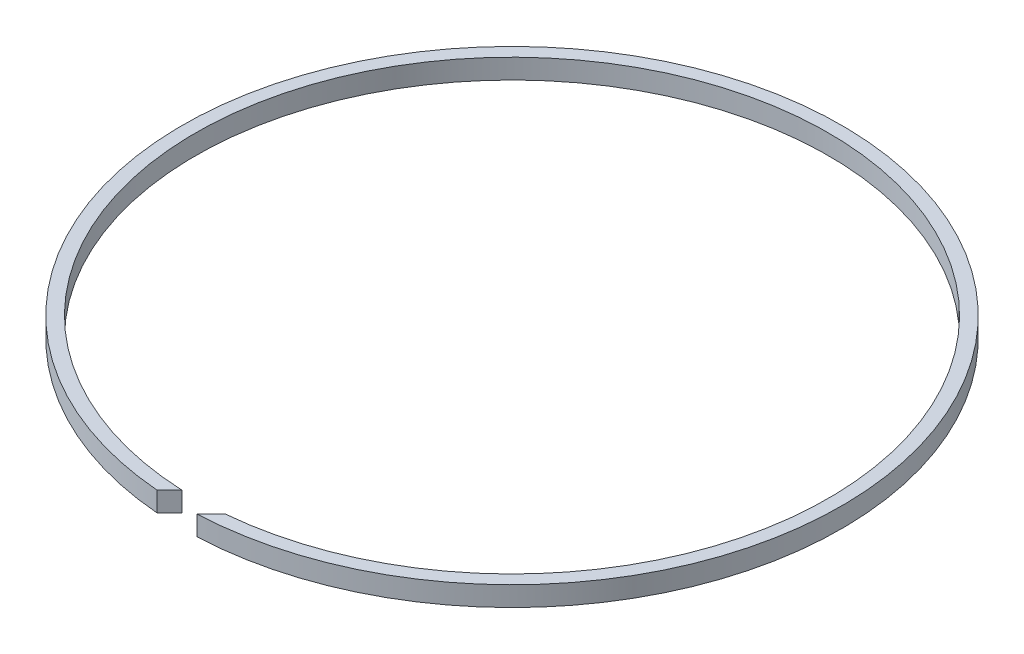
ISO-10303-21;
HEADER;
FILE_DESCRIPTION(('STEP AP214'),'2;1');
FILE_NAME('part.step','',(''),(''),'','','');
FILE_SCHEMA(('AUTOMOTIVE_DESIGN { 1 0 10303 214 1 1 1 1 }'));
ENDSEC;
DATA;
#1=APPLICATION_CONTEXT('core data for automotive mechanical design processes');
#2=APPLICATION_PROTOCOL_DEFINITION('international standard','automotive_design',2000,#1);
#3=PRODUCT_CONTEXT('',#1,'mechanical');
#4=PRODUCT('Part','Part','',(#3));
#5=PRODUCT_RELATED_PRODUCT_CATEGORY('part','',(#4));
#6=PRODUCT_DEFINITION_FORMATION('','',#4);
#7=PRODUCT_DEFINITION_CONTEXT('part definition',#1,'design');
#8=PRODUCT_DEFINITION('design','',#6,#7);
#9=PRODUCT_DEFINITION_SHAPE('','',#8);
#10=(LENGTH_UNIT() NAMED_UNIT(*) SI_UNIT(.MILLI.,.METRE.));
#11=(NAMED_UNIT(*) PLANE_ANGLE_UNIT() SI_UNIT($,.RADIAN.));
#12=(NAMED_UNIT(*) SI_UNIT($,.STERADIAN.) SOLID_ANGLE_UNIT());
#13=UNCERTAINTY_MEASURE_WITH_UNIT(LENGTH_MEASURE(1.E-05),#10,'distance_accuracy_value','');
#14=(GEOMETRIC_REPRESENTATION_CONTEXT(3) GLOBAL_UNCERTAINTY_ASSIGNED_CONTEXT((#13)) GLOBAL_UNIT_ASSIGNED_CONTEXT((#10,
#11,#12)) REPRESENTATION_CONTEXT('',''));
#15=CARTESIAN_POINT('',(0.,0.,0.));
#16=DIRECTION('',(0.,0.,1.));
#17=DIRECTION('',(1.,0.,0.));
#18=AXIS2_PLACEMENT_3D('',#15,#16,#17);
#19=CARTESIAN_POINT('',(0.,3.81,0.));
#20=DIRECTION('',(0.,1.,0.));
#21=DIRECTION('',(0.,0.,1.));
#22=AXIS2_PLACEMENT_3D('',#19,#20,#21);
#23=PLANE('',#22);
#24=DIRECTION('',(0.707106781186547,0.,-0.707106781186548));
#25=VECTOR('',#24,1.);
#26=CARTESIAN_POINT('',(7.94512835720863,3.81,58.2848716427914));
#27=LINE('',#26,#25);
#28=CARTESIAN_POINT('',(2.79138255418722,3.81,63.4386174458128));
#29=VERTEX_POINT('',#28);
#30=CARTESIAN_POINT('',(5.52047925764971,3.81,60.7095207423503));
#31=VERTEX_POINT('',#30);
#32=EDGE_CURVE('E68',#29,#31,#27,.T.);
#33=ORIENTED_EDGE('',*,*,#32,.F.);
#34=CARTESIAN_POINT('',(0.,3.81,0.));
#35=DIRECTION('',(0.,1.,0.));
#36=DIRECTION('',(0.,0.,1.));
#37=AXIS2_PLACEMENT_3D('',#34,#35,#36);
#38=CIRCLE('',#37,63.5);
#39=CARTESIAN_POINT('',(-5.06747760183572,3.81,63.2974776018357));
#40=VERTEX_POINT('',#39);
#41=EDGE_CURVE('E92',#29,#40,#38,.T.);
#42=ORIENTED_EDGE('',*,*,#41,.T.);
#43=DIRECTION('',(-0.707106781186547,0.,0.707106781186548));
#44=VECTOR('',#43,1.);
#45=CARTESIAN_POINT('',(-7.91754239700286,3.81,66.1475423970029));
#46=LINE('',#45,#44);
#47=CARTESIAN_POINT('',(-2.67143696610238,3.81,60.9014369661024));
#48=VERTEX_POINT('',#47);
#49=EDGE_CURVE('E85',#48,#40,#46,.T.);
#50=ORIENTED_EDGE('',*,*,#49,.F.);
#51=CARTESIAN_POINT('',(0.,3.81,0.));
#52=DIRECTION('',(0.,1.,0.));
#53=DIRECTION('',(0.,0.,1.));
#54=AXIS2_PLACEMENT_3D('',#51,#52,#53);
#55=CIRCLE('',#54,60.96);
#56=EDGE_CURVE('E96',#31,#48,#55,.T.);
#57=ORIENTED_EDGE('',*,*,#56,.F.);
#58=EDGE_LOOP('',(#33,#42,#50,#57));
#59=FACE_BOUND('',#58,.T.);
#60=ADVANCED_FACE('F45',(#59),#23,.T.);
#61=CARTESIAN_POINT('',(0.,0.,0.));
#62=DIRECTION('',(0.,1.,0.));
#63=DIRECTION('',(0.,0.,1.));
#64=AXIS2_PLACEMENT_3D('',#61,#62,#63);
#65=PLANE('',#64);
#66=CARTESIAN_POINT('',(0.,0.,0.));
#67=DIRECTION('',(0.,1.,0.));
#68=DIRECTION('',(0.,0.,1.));
#69=AXIS2_PLACEMENT_3D('',#66,#67,#68);
#70=CIRCLE('',#69,63.5);
#71=CARTESIAN_POINT('',(2.79138255418722,0.,63.4386174458128));
#72=VERTEX_POINT('',#71);
#73=CARTESIAN_POINT('',(-5.06747760183572,0.,63.2974776018357));
#74=VERTEX_POINT('',#73);
#75=EDGE_CURVE('E102',#72,#74,#70,.T.);
#76=ORIENTED_EDGE('',*,*,#75,.F.);
#77=DIRECTION('',(0.707106781186547,0.,-0.707106781186548));
#78=VECTOR('',#77,1.);
#79=CARTESIAN_POINT('',(7.94512835720863,0.,58.2848716427914));
#80=LINE('',#79,#78);
#81=CARTESIAN_POINT('',(5.52047925764971,0.,60.7095207423503));
#82=VERTEX_POINT('',#81);
#83=EDGE_CURVE('E120',#72,#82,#80,.T.);
#84=ORIENTED_EDGE('',*,*,#83,.T.);
#85=CARTESIAN_POINT('',(0.,0.,0.));
#86=DIRECTION('',(0.,1.,0.));
#87=DIRECTION('',(0.,0.,1.));
#88=AXIS2_PLACEMENT_3D('',#85,#86,#87);
#89=CIRCLE('',#88,60.96);
#90=CARTESIAN_POINT('',(-2.67143696610238,0.,60.9014369661024));
#91=VERTEX_POINT('',#90);
#92=EDGE_CURVE('E103',#82,#91,#89,.T.);
#93=ORIENTED_EDGE('',*,*,#92,.T.);
#94=DIRECTION('',(-0.707106781186547,0.,0.707106781186548));
#95=VECTOR('',#94,1.);
#96=CARTESIAN_POINT('',(-7.91754239700286,0.,66.1475423970029));
#97=LINE('',#96,#95);
#98=EDGE_CURVE('E61',#91,#74,#97,.T.);
#99=ORIENTED_EDGE('',*,*,#98,.T.);
#100=EDGE_LOOP('',(#76,#84,#93,#99));
#101=FACE_BOUND('',#100,.T.);
#102=ADVANCED_FACE('F129',(#101),#65,.F.);
#103=CARTESIAN_POINT('',(0.,3.81,0.));
#104=DIRECTION('',(0.,-1.,0.));
#105=DIRECTION('',(0.,0.,-1.));
#106=AXIS2_PLACEMENT_3D('',#103,#104,#105);
#107=CYLINDRICAL_SURFACE('',#106,63.5);
#108=ORIENTED_EDGE('',*,*,#41,.F.);
#109=DIRECTION('',(0.,-1.,0.));
#110=VECTOR('',#109,1.);
#111=CARTESIAN_POINT('',(2.79138255418722,3.81,63.4386174458128));
#112=LINE('',#111,#110);
#113=EDGE_CURVE('E109',#29,#72,#112,.T.);
#114=ORIENTED_EDGE('',*,*,#113,.T.);
#115=ORIENTED_EDGE('',*,*,#75,.T.);
#116=DIRECTION('',(0.,-1.,0.));
#117=VECTOR('',#116,1.);
#118=CARTESIAN_POINT('',(-5.06747760183572,3.81,63.2974776018357));
#119=LINE('',#118,#117);
#120=EDGE_CURVE('E117',#74,#40,#119,.F.);
#121=ORIENTED_EDGE('',*,*,#120,.T.);
#122=EDGE_LOOP('',(#108,#114,#115,#121));
#123=FACE_BOUND('',#122,.T.);
#124=ADVANCED_FACE('F47',(#123),#107,.T.);
#125=CARTESIAN_POINT('',(0.,3.81,0.));
#126=DIRECTION('',(0.,-1.,0.));
#127=DIRECTION('',(0.,0.,-1.));
#128=AXIS2_PLACEMENT_3D('',#125,#126,#127);
#129=CYLINDRICAL_SURFACE('',#128,60.96);
#130=DIRECTION('',(0.,-1.,0.));
#131=VECTOR('',#130,1.);
#132=CARTESIAN_POINT('',(5.52047925764971,3.81,60.7095207423503));
#133=LINE('',#132,#131);
#134=EDGE_CURVE('E11',#31,#82,#133,.T.);
#135=ORIENTED_EDGE('',*,*,#134,.F.);
#136=ORIENTED_EDGE('',*,*,#56,.T.);
#137=DIRECTION('',(0.,-1.,0.));
#138=VECTOR('',#137,1.);
#139=CARTESIAN_POINT('',(-2.67143696610238,3.81,60.9014369661024));
#140=LINE('',#139,#138);
#141=EDGE_CURVE('E54',#91,#48,#140,.F.);
#142=ORIENTED_EDGE('',*,*,#141,.F.);
#143=ORIENTED_EDGE('',*,*,#92,.F.);
#144=EDGE_LOOP('',(#135,#136,#142,#143));
#145=FACE_BOUND('',#144,.T.);
#146=ADVANCED_FACE('F100',(#145),#129,.F.);
#147=CARTESIAN_POINT('',(-7.91754239700286,0.,66.1475423970029));
#148=DIRECTION('',(-0.707106781186548,0.,-0.707106781186547));
#149=DIRECTION('',(-0.707106781186547,0.,0.707106781186548));
#150=AXIS2_PLACEMENT_3D('',#147,#148,#149);
#151=PLANE('',#150);
#152=ORIENTED_EDGE('',*,*,#98,.F.);
#153=ORIENTED_EDGE('',*,*,#141,.T.);
#154=ORIENTED_EDGE('',*,*,#49,.T.);
#155=ORIENTED_EDGE('',*,*,#120,.F.);
#156=EDGE_LOOP('',(#152,#153,#154,#155));
#157=FACE_BOUND('',#156,.T.);
#158=ADVANCED_FACE('F84',(#157),#151,.F.);
#159=CARTESIAN_POINT('',(7.94512835720863,0.,58.2848716427914));
#160=DIRECTION('',(0.707106781186548,0.,0.707106781186547));
#161=DIRECTION('',(0.707106781186547,0.,-0.707106781186548));
#162=AXIS2_PLACEMENT_3D('',#159,#160,#161);
#163=PLANE('',#162);
#164=ORIENTED_EDGE('',*,*,#32,.T.);
#165=ORIENTED_EDGE('',*,*,#134,.T.);
#166=ORIENTED_EDGE('',*,*,#83,.F.);
#167=ORIENTED_EDGE('',*,*,#113,.F.);
#168=EDGE_LOOP('',(#164,#165,#166,#167));
#169=FACE_BOUND('',#168,.T.);
#170=ADVANCED_FACE('F131',(#169),#163,.F.);
#171=CLOSED_SHELL('',(#60,#102,#124,#146,#158,#170));
#172=MANIFOLD_SOLID_BREP('B2',#171);
#173=ADVANCED_BREP_SHAPE_REPRESENTATION('',(#18,#172),#14);
#174=SHAPE_DEFINITION_REPRESENTATION(#9,#173);
ENDSEC;
END-ISO-10303-21;
